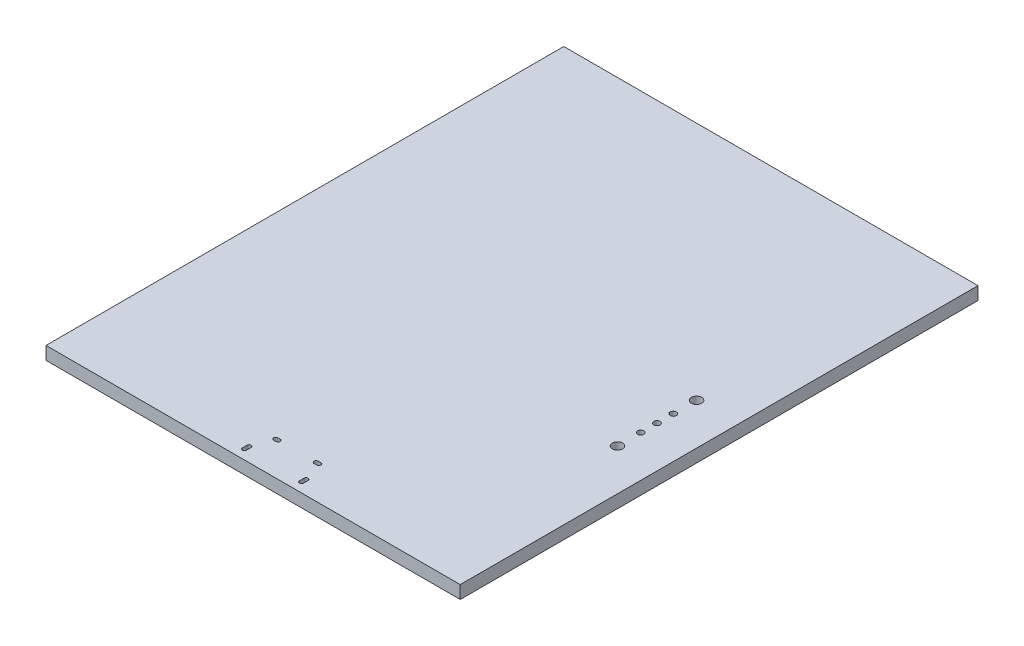
ISO-10303-21;
HEADER;
FILE_DESCRIPTION(('STEP AP214'),'2;1');
FILE_NAME('part.step','',(''),(''),'','','');
FILE_SCHEMA(('AUTOMOTIVE_DESIGN { 1 0 10303 214 1 1 1 1 }'));
ENDSEC;
DATA;
#1=APPLICATION_CONTEXT('core data for automotive mechanical design processes');
#2=APPLICATION_PROTOCOL_DEFINITION('international standard','automotive_design',2000,#1);
#3=PRODUCT_CONTEXT('',#1,'mechanical');
#4=PRODUCT('Part','Part','',(#3));
#5=PRODUCT_RELATED_PRODUCT_CATEGORY('part','',(#4));
#6=PRODUCT_DEFINITION_FORMATION('','',#4);
#7=PRODUCT_DEFINITION_CONTEXT('part definition',#1,'design');
#8=PRODUCT_DEFINITION('design','',#6,#7);
#9=PRODUCT_DEFINITION_SHAPE('','',#8);
#10=(LENGTH_UNIT() NAMED_UNIT(*) SI_UNIT(.MILLI.,.METRE.));
#11=(NAMED_UNIT(*) PLANE_ANGLE_UNIT() SI_UNIT($,.RADIAN.));
#12=(NAMED_UNIT(*) SI_UNIT($,.STERADIAN.) SOLID_ANGLE_UNIT());
#13=UNCERTAINTY_MEASURE_WITH_UNIT(LENGTH_MEASURE(1.E-05),#10,'distance_accuracy_value','');
#14=(GEOMETRIC_REPRESENTATION_CONTEXT(3) GLOBAL_UNCERTAINTY_ASSIGNED_CONTEXT((#13)) GLOBAL_UNIT_ASSIGNED_CONTEXT((#10,
#11,#12)) REPRESENTATION_CONTEXT('',''));
#15=CARTESIAN_POINT('',(0.,0.,0.));
#16=DIRECTION('',(0.,0.,1.));
#17=DIRECTION('',(1.,0.,0.));
#18=AXIS2_PLACEMENT_3D('',#15,#16,#17);
#19=CARTESIAN_POINT('',(-25.4,1.5875,-31.75));
#20=DIRECTION('',(1.,0.,0.));
#21=DIRECTION('',(0.,0.,-1.));
#22=AXIS2_PLACEMENT_3D('',#19,#20,#21);
#23=PLANE('',#22);
#24=DIRECTION('',(0.,0.,1.));
#25=VECTOR('',#24,1.);
#26=CARTESIAN_POINT('',(-25.4,0.,-31.75));
#27=LINE('',#26,#25);
#28=CARTESIAN_POINT('',(-25.4,0.,-31.75));
#29=VERTEX_POINT('',#28);
#30=CARTESIAN_POINT('',(-25.4,0.,31.75));
#31=VERTEX_POINT('',#30);
#32=EDGE_CURVE('E330',#29,#31,#27,.T.);
#33=ORIENTED_EDGE('',*,*,#32,.T.);
#34=DIRECTION('',(0.,-1.,0.));
#35=VECTOR('',#34,1.);
#36=CARTESIAN_POINT('',(-25.4,1.5875,31.75));
#37=LINE('',#36,#35);
#38=CARTESIAN_POINT('',(-25.4,1.5875,31.75));
#39=VERTEX_POINT('',#38);
#40=EDGE_CURVE('E11',#39,#31,#37,.T.);
#41=ORIENTED_EDGE('',*,*,#40,.F.);
#42=DIRECTION('',(0.,0.,1.));
#43=VECTOR('',#42,1.);
#44=CARTESIAN_POINT('',(-25.4,1.5875,-31.75));
#45=LINE('',#44,#43);
#46=CARTESIAN_POINT('',(-25.4,1.5875,-31.75));
#47=VERTEX_POINT('',#46);
#48=EDGE_CURVE('E333',#47,#39,#45,.T.);
#49=ORIENTED_EDGE('',*,*,#48,.F.);
#50=DIRECTION('',(0.,-1.,0.));
#51=VECTOR('',#50,1.);
#52=CARTESIAN_POINT('',(-25.4,1.5875,-31.75));
#53=LINE('',#52,#51);
#54=EDGE_CURVE('E343',#47,#29,#53,.T.);
#55=ORIENTED_EDGE('',*,*,#54,.T.);
#56=EDGE_LOOP('',(#33,#41,#49,#55));
#57=FACE_BOUND('',#56,.T.);
#58=ADVANCED_FACE('F34',(#57),#23,.F.);
#59=CARTESIAN_POINT('',(-25.4,1.5875,31.75));
#60=DIRECTION('',(0.,0.,-1.));
#61=DIRECTION('',(-1.,0.,0.));
#62=AXIS2_PLACEMENT_3D('',#59,#60,#61);
#63=PLANE('',#62);
#64=DIRECTION('',(1.,0.,0.));
#65=VECTOR('',#64,1.);
#66=CARTESIAN_POINT('',(-25.4,0.,31.75));
#67=LINE('',#66,#65);
#68=CARTESIAN_POINT('',(25.4,0.,31.75));
#69=VERTEX_POINT('',#68);
#70=EDGE_CURVE('E346',#31,#69,#67,.T.);
#71=ORIENTED_EDGE('',*,*,#70,.T.);
#72=DIRECTION('',(0.,-1.,0.));
#73=VECTOR('',#72,1.);
#74=CARTESIAN_POINT('',(25.4,1.5875,31.75));
#75=LINE('',#74,#73);
#76=CARTESIAN_POINT('',(25.4,1.5875,31.75));
#77=VERTEX_POINT('',#76);
#78=EDGE_CURVE('E41',#77,#69,#75,.T.);
#79=ORIENTED_EDGE('',*,*,#78,.F.);
#80=DIRECTION('',(1.,0.,0.));
#81=VECTOR('',#80,1.);
#82=CARTESIAN_POINT('',(-25.4,1.5875,31.75));
#83=LINE('',#82,#81);
#84=EDGE_CURVE('E336',#39,#77,#83,.T.);
#85=ORIENTED_EDGE('',*,*,#84,.F.);
#86=ORIENTED_EDGE('',*,*,#40,.T.);
#87=EDGE_LOOP('',(#71,#79,#85,#86));
#88=FACE_BOUND('',#87,.T.);
#89=ADVANCED_FACE('F375',(#88),#63,.F.);
#90=CARTESIAN_POINT('',(25.4,1.5875,-31.75));
#91=DIRECTION('',(-1.,0.,0.));
#92=DIRECTION('',(0.,0.,1.));
#93=AXIS2_PLACEMENT_3D('',#90,#91,#92);
#94=PLANE('',#93);
#95=DIRECTION('',(0.,0.,-1.));
#96=VECTOR('',#95,1.);
#97=CARTESIAN_POINT('',(25.4,0.,-31.75));
#98=LINE('',#97,#96);
#99=CARTESIAN_POINT('',(25.4,0.,-31.75));
#100=VERTEX_POINT('',#99);
#101=EDGE_CURVE('E348',#69,#100,#98,.T.);
#102=ORIENTED_EDGE('',*,*,#101,.T.);
#103=DIRECTION('',(0.,-1.,0.));
#104=VECTOR('',#103,1.);
#105=CARTESIAN_POINT('',(25.4,1.5875,-31.75));
#106=LINE('',#105,#104);
#107=CARTESIAN_POINT('',(25.4,1.5875,-31.75));
#108=VERTEX_POINT('',#107);
#109=EDGE_CURVE('E353',#108,#100,#106,.T.);
#110=ORIENTED_EDGE('',*,*,#109,.F.);
#111=DIRECTION('',(0.,0.,-1.));
#112=VECTOR('',#111,1.);
#113=CARTESIAN_POINT('',(25.4,1.5875,-31.75));
#114=LINE('',#113,#112);
#115=EDGE_CURVE('E339',#77,#108,#114,.T.);
#116=ORIENTED_EDGE('',*,*,#115,.F.);
#117=ORIENTED_EDGE('',*,*,#78,.T.);
#118=EDGE_LOOP('',(#102,#110,#116,#117));
#119=FACE_BOUND('',#118,.T.);
#120=ADVANCED_FACE('F360',(#119),#94,.F.);
#121=CARTESIAN_POINT('',(-25.4,1.5875,-31.75));
#122=DIRECTION('',(0.,0.,1.));
#123=DIRECTION('',(1.,0.,0.));
#124=AXIS2_PLACEMENT_3D('',#121,#122,#123);
#125=PLANE('',#124);
#126=DIRECTION('',(-1.,0.,0.));
#127=VECTOR('',#126,1.);
#128=CARTESIAN_POINT('',(-25.4,0.,-31.75));
#129=LINE('',#128,#127);
#130=EDGE_CURVE('E337',#100,#29,#129,.T.);
#131=ORIENTED_EDGE('',*,*,#130,.T.);
#132=ORIENTED_EDGE('',*,*,#54,.F.);
#133=DIRECTION('',(-1.,0.,0.));
#134=VECTOR('',#133,1.);
#135=CARTESIAN_POINT('',(-25.4,1.5875,-31.75));
#136=LINE('',#135,#134);
#137=EDGE_CURVE('E341',#108,#47,#136,.T.);
#138=ORIENTED_EDGE('',*,*,#137,.F.);
#139=ORIENTED_EDGE('',*,*,#109,.T.);
#140=EDGE_LOOP('',(#131,#132,#138,#139));
#141=FACE_BOUND('',#140,.T.);
#142=ADVANCED_FACE('F368',(#141),#125,.F.);
#143=CARTESIAN_POINT('',(0.,1.5875,0.));
#144=DIRECTION('',(0.,1.,0.));
#145=DIRECTION('',(0.,0.,1.));
#146=AXIS2_PLACEMENT_3D('',#143,#144,#145);
#147=PLANE('',#146);
#148=CARTESIAN_POINT('',(4.76998942836322,1.5875,30.0269949062346));
#149=DIRECTION('',(0.,1.,0.));
#150=DIRECTION('',(0.,0.,1.));
#151=AXIS2_PLACEMENT_3D('',#148,#149,#150);
#152=CIRCLE('',#151,0.250000134999998);
#153=CARTESIAN_POINT('',(5.01998956336322,1.5875,30.0269949062346));
#154=VERTEX_POINT('',#153);
#155=CARTESIAN_POINT('',(4.51998929336322,1.5875,30.0269949062346));
#156=VERTEX_POINT('',#155);
#157=EDGE_CURVE('E48',#154,#156,#152,.T.);
#158=ORIENTED_EDGE('',*,*,#157,.F.);
#159=DIRECTION('',(0.,0.,-1.));
#160=VECTOR('',#159,1.);
#161=CARTESIAN_POINT('',(5.01998956336322,1.5875,30.0269949062346));
#162=LINE('',#161,#160);
#163=CARTESIAN_POINT('',(5.01998956336322,1.5875,30.5769963462346));
#164=VERTEX_POINT('',#163);
#165=EDGE_CURVE('E188',#164,#154,#162,.T.);
#166=ORIENTED_EDGE('',*,*,#165,.F.);
#167=CARTESIAN_POINT('',(4.76998942836322,1.5875,30.5769963462346));
#168=DIRECTION('',(0.,1.,0.));
#169=DIRECTION('',(0.,0.,1.));
#170=AXIS2_PLACEMENT_3D('',#167,#168,#169);
#171=CIRCLE('',#170,0.250000134999998);
#172=CARTESIAN_POINT('',(4.51998929336322,1.5875,30.5769963462346));
#173=VERTEX_POINT('',#172);
#174=EDGE_CURVE('E191',#173,#164,#171,.T.);
#175=ORIENTED_EDGE('',*,*,#174,.F.);
#176=DIRECTION('',(0.,0.,1.));
#177=VECTOR('',#176,1.);
#178=CARTESIAN_POINT('',(4.51998929336322,1.5875,30.0269949062346));
#179=LINE('',#178,#177);
#180=EDGE_CURVE('E197',#156,#173,#179,.T.);
#181=ORIENTED_EDGE('',*,*,#180,.F.);
#182=EDGE_LOOP('',(#158,#166,#175,#181));
#183=FACE_BOUND('',#182,.T.);
#184=CARTESIAN_POINT('',(3.56998928836323,1.5875,27.6019959462346));
#185=DIRECTION('',(0.,1.,0.));
#186=DIRECTION('',(0.,0.,1.));
#187=AXIS2_PLACEMENT_3D('',#184,#185,#186);
#188=CIRCLE('',#187,0.250000134999984);
#189=CARTESIAN_POINT('',(3.56998928836323,1.5875,27.3519958112346));
#190=VERTEX_POINT('',#189);
#191=CARTESIAN_POINT('',(3.56998928836323,1.5875,27.8519960812346));
#192=VERTEX_POINT('',#191);
#193=EDGE_CURVE('E203',#190,#192,#188,.T.);
#194=ORIENTED_EDGE('',*,*,#193,.F.);
#195=DIRECTION('',(-1.,0.,0.));
#196=VECTOR('',#195,1.);
#197=CARTESIAN_POINT('',(3.56998928836323,1.5875,27.3519958112346));
#198=LINE('',#197,#196);
#199=CARTESIAN_POINT('',(3.91998858836322,1.5875,27.3519958112346));
#200=VERTEX_POINT('',#199);
#201=EDGE_CURVE('E211',#200,#190,#198,.T.);
#202=ORIENTED_EDGE('',*,*,#201,.F.);
#203=CARTESIAN_POINT('',(3.91998858836322,1.5875,27.6019959462346));
#204=DIRECTION('',(0.,1.,0.));
#205=DIRECTION('',(0.,0.,1.));
#206=AXIS2_PLACEMENT_3D('',#203,#204,#205);
#207=CIRCLE('',#206,0.25000013499998);
#208=CARTESIAN_POINT('',(3.91998858836322,1.5875,27.8519960812346));
#209=VERTEX_POINT('',#208);
#210=EDGE_CURVE('E225',#209,#200,#207,.T.);
#211=ORIENTED_EDGE('',*,*,#210,.F.);
#212=DIRECTION('',(1.,0.,0.));
#213=VECTOR('',#212,1.);
#214=CARTESIAN_POINT('',(3.56998928836323,1.5875,27.8519960812346));
#215=LINE('',#214,#213);
#216=EDGE_CURVE('E222',#192,#209,#215,.T.);
#217=ORIENTED_EDGE('',*,*,#216,.F.);
#218=EDGE_LOOP('',(#194,#202,#211,#217));
#219=FACE_BOUND('',#218,.T.);
#220=CARTESIAN_POINT('',(-1.38001097163677,1.5875,27.6019959462346));
#221=DIRECTION('',(0.,1.,0.));
#222=DIRECTION('',(0.,0.,1.));
#223=AXIS2_PLACEMENT_3D('',#220,#221,#222);
#224=CIRCLE('',#223,0.250000134999998);
#225=CARTESIAN_POINT('',(-1.38001097163677,1.5875,27.3519958112346));
#226=VERTEX_POINT('',#225);
#227=CARTESIAN_POINT('',(-1.38001097163677,1.5875,27.8519960812346));
#228=VERTEX_POINT('',#227);
#229=EDGE_CURVE('E232',#226,#228,#224,.T.);
#230=ORIENTED_EDGE('',*,*,#229,.F.);
#231=DIRECTION('',(-1.,0.,0.));
#232=VECTOR('',#231,1.);
#233=CARTESIAN_POINT('',(-1.38001097163677,1.5875,27.3519958112346));
#234=LINE('',#233,#232);
#235=CARTESIAN_POINT('',(-1.0800115716368,1.5875,27.3519958112346));
#236=VERTEX_POINT('',#235);
#237=EDGE_CURVE('E243',#236,#226,#234,.T.);
#238=ORIENTED_EDGE('',*,*,#237,.F.);
#239=CARTESIAN_POINT('',(-1.0800115716368,1.5875,27.6019959462346));
#240=DIRECTION('',(0.,1.,0.));
#241=DIRECTION('',(0.,0.,1.));
#242=AXIS2_PLACEMENT_3D('',#239,#240,#241);
#243=CIRCLE('',#242,0.250000134999998);
#244=CARTESIAN_POINT('',(-1.0800115716368,1.5875,27.8519960812346));
#245=VERTEX_POINT('',#244);
#246=EDGE_CURVE('E257',#245,#236,#243,.T.);
#247=ORIENTED_EDGE('',*,*,#246,.F.);
#248=DIRECTION('',(1.,0.,0.));
#249=VECTOR('',#248,1.);
#250=CARTESIAN_POINT('',(-1.38001097163677,1.5875,27.8519960812346));
#251=LINE('',#250,#249);
#252=EDGE_CURVE('E254',#228,#245,#251,.T.);
#253=ORIENTED_EDGE('',*,*,#252,.F.);
#254=EDGE_LOOP('',(#230,#238,#247,#253));
#255=FACE_BOUND('',#254,.T.);
#256=CARTESIAN_POINT('',(-2.23001181163678,1.5875,30.0269949062346));
#257=DIRECTION('',(0.,1.,0.));
#258=DIRECTION('',(0.,0.,1.));
#259=AXIS2_PLACEMENT_3D('',#256,#257,#258);
#260=CIRCLE('',#259,0.250000134999983);
#261=CARTESIAN_POINT('',(-1.98001167663679,1.5875,30.0269949062346));
#262=VERTEX_POINT('',#261);
#263=CARTESIAN_POINT('',(-2.48001194663676,1.5875,30.0269949062346));
#264=VERTEX_POINT('',#263);
#265=EDGE_CURVE('E264',#262,#264,#260,.T.);
#266=ORIENTED_EDGE('',*,*,#265,.F.);
#267=DIRECTION('',(0.,0.,-1.));
#268=VECTOR('',#267,1.);
#269=CARTESIAN_POINT('',(-1.98001167663679,1.5875,30.0269949062346));
#270=LINE('',#269,#268);
#271=CARTESIAN_POINT('',(-1.98001167663679,1.5875,30.5769963462346));
#272=VERTEX_POINT('',#271);
#273=EDGE_CURVE('E275',#272,#262,#270,.T.);
#274=ORIENTED_EDGE('',*,*,#273,.F.);
#275=CARTESIAN_POINT('',(-2.23001181163678,1.5875,30.5769963462346));
#276=DIRECTION('',(0.,1.,0.));
#277=DIRECTION('',(0.,0.,1.));
#278=AXIS2_PLACEMENT_3D('',#275,#276,#277);
#279=CIRCLE('',#278,0.250000134999983);
#280=CARTESIAN_POINT('',(-2.48001194663676,1.5875,30.5769963462346));
#281=VERTEX_POINT('',#280);
#282=EDGE_CURVE('E289',#281,#272,#279,.T.);
#283=ORIENTED_EDGE('',*,*,#282,.F.);
#284=DIRECTION('',(0.,0.,1.));
#285=VECTOR('',#284,1.);
#286=CARTESIAN_POINT('',(-2.48001194663676,1.5875,30.0269949062346));
#287=LINE('',#286,#285);
#288=EDGE_CURVE('E286',#264,#281,#287,.T.);
#289=ORIENTED_EDGE('',*,*,#288,.F.);
#290=EDGE_LOOP('',(#266,#274,#283,#289));
#291=FACE_BOUND('',#290,.T.);
#292=CARTESIAN_POINT('',(20.3199888083632,1.5875,-2.31020483376541));
#293=DIRECTION('',(0.,1.,0.));
#294=DIRECTION('',(0.,0.,1.));
#295=AXIS2_PLACEMENT_3D('',#292,#293,#294);
#296=CIRCLE('',#295,0.631750069999991);
#297=CARTESIAN_POINT('',(20.3199888083632,1.5875,-1.67845476376542));
#298=VERTEX_POINT('',#297);
#299=EDGE_CURVE('E296',#298,#298,#296,.T.);
#300=ORIENTED_EDGE('',*,*,#299,.F.);
#301=EDGE_LOOP('',(#300));
#302=FACE_BOUND('',#301,.T.);
#303=CARTESIAN_POINT('',(20.3199888083632,1.5875,0.539794546234582));
#304=DIRECTION('',(0.,1.,0.));
#305=DIRECTION('',(0.,0.,1.));
#306=AXIS2_PLACEMENT_3D('',#303,#304,#305);
#307=CIRCLE('',#306,0.38174993499998);
#308=CARTESIAN_POINT('',(20.3199888083632,1.5875,0.921544481234561));
#309=VERTEX_POINT('',#308);
#310=EDGE_CURVE('E306',#309,#309,#307,.T.);
#311=ORIENTED_EDGE('',*,*,#310,.F.);
#312=EDGE_LOOP('',(#311));
#313=FACE_BOUND('',#312,.T.);
#314=CARTESIAN_POINT('',(20.3199888083632,1.5875,2.53979562623462));
#315=DIRECTION('',(0.,1.,0.));
#316=DIRECTION('',(0.,0.,1.));
#317=AXIS2_PLACEMENT_3D('',#314,#315,#316);
#318=CIRCLE('',#317,0.381749935000009);
#319=CARTESIAN_POINT('',(20.3199888083632,1.5875,2.92154556123463));
#320=VERTEX_POINT('',#319);
#321=EDGE_CURVE('E312',#320,#320,#318,.T.);
#322=ORIENTED_EDGE('',*,*,#321,.F.);
#323=EDGE_LOOP('',(#322));
#324=FACE_BOUND('',#323,.T.);
#325=CARTESIAN_POINT('',(20.3199888083632,1.5875,4.5397967062346));
#326=DIRECTION('',(0.,1.,0.));
#327=DIRECTION('',(0.,0.,1.));
#328=AXIS2_PLACEMENT_3D('',#325,#326,#327);
#329=CIRCLE('',#328,0.381749935000009);
#330=CARTESIAN_POINT('',(20.3199888083632,1.5875,4.92154664123461));
#331=VERTEX_POINT('',#330);
#332=EDGE_CURVE('E318',#331,#331,#329,.T.);
#333=ORIENTED_EDGE('',*,*,#332,.F.);
#334=EDGE_LOOP('',(#333));
#335=FACE_BOUND('',#334,.T.);
#336=CARTESIAN_POINT('',(20.3199888083632,1.5875,7.38979608623459));
#337=DIRECTION('',(0.,1.,0.));
#338=DIRECTION('',(0.,0.,1.));
#339=AXIS2_PLACEMENT_3D('',#336,#337,#338);
#340=CIRCLE('',#339,0.631750069999991);
#341=CARTESIAN_POINT('',(20.3199888083632,1.5875,8.02154615623458));
#342=VERTEX_POINT('',#341);
#343=EDGE_CURVE('E324',#342,#342,#340,.T.);
#344=ORIENTED_EDGE('',*,*,#343,.F.);
#345=EDGE_LOOP('',(#344));
#346=FACE_BOUND('',#345,.T.);
#347=ORIENTED_EDGE('',*,*,#48,.T.);
#348=ORIENTED_EDGE('',*,*,#84,.T.);
#349=ORIENTED_EDGE('',*,*,#115,.T.);
#350=ORIENTED_EDGE('',*,*,#137,.T.);
#351=EDGE_LOOP('',(#347,#348,#349,#350));
#352=FACE_BOUND('',#351,.T.);
#353=ADVANCED_FACE('F374',(#183,#219,#255,#291,#302,#313,#324,#335,#346,#352),#147,.T.);
#354=CARTESIAN_POINT('',(0.,0.,0.));
#355=DIRECTION('',(0.,1.,0.));
#356=DIRECTION('',(0.,0.,1.));
#357=AXIS2_PLACEMENT_3D('',#354,#355,#356);
#358=PLANE('',#357);
#359=DIRECTION('',(0.,0.,-1.));
#360=VECTOR('',#359,1.);
#361=CARTESIAN_POINT('',(5.01998956336322,0.,30.0269949062346));
#362=LINE('',#361,#360);
#363=CARTESIAN_POINT('',(5.01998956336322,0.,30.5769963462346));
#364=VERTEX_POINT('',#363);
#365=CARTESIAN_POINT('',(5.01998956336322,0.,30.0269949062346));
#366=VERTEX_POINT('',#365);
#367=EDGE_CURVE('E178',#364,#366,#362,.T.);
#368=ORIENTED_EDGE('',*,*,#367,.T.);
#369=CARTESIAN_POINT('',(4.76998942836322,0.,30.0269949062346));
#370=DIRECTION('',(0.,1.,0.));
#371=DIRECTION('',(0.,0.,1.));
#372=AXIS2_PLACEMENT_3D('',#369,#370,#371);
#373=CIRCLE('',#372,0.250000134999998);
#374=CARTESIAN_POINT('',(4.51998929336322,0.,30.0269949062346));
#375=VERTEX_POINT('',#374);
#376=EDGE_CURVE('E172',#366,#375,#373,.T.);
#377=ORIENTED_EDGE('',*,*,#376,.T.);
#378=DIRECTION('',(0.,0.,1.));
#379=VECTOR('',#378,1.);
#380=CARTESIAN_POINT('',(4.51998929336322,0.,30.0269949062346));
#381=LINE('',#380,#379);
#382=CARTESIAN_POINT('',(4.51998929336322,0.,30.5769963462346));
#383=VERTEX_POINT('',#382);
#384=EDGE_CURVE('E181',#375,#383,#381,.T.);
#385=ORIENTED_EDGE('',*,*,#384,.T.);
#386=CARTESIAN_POINT('',(4.76998942836322,0.,30.5769963462346));
#387=DIRECTION('',(0.,1.,0.));
#388=DIRECTION('',(0.,0.,1.));
#389=AXIS2_PLACEMENT_3D('',#386,#387,#388);
#390=CIRCLE('',#389,0.250000134999998);
#391=EDGE_CURVE('E56',#383,#364,#390,.T.);
#392=ORIENTED_EDGE('',*,*,#391,.T.);
#393=EDGE_LOOP('',(#368,#377,#385,#392));
#394=FACE_BOUND('',#393,.T.);
#395=DIRECTION('',(-1.,0.,0.));
#396=VECTOR('',#395,1.);
#397=CARTESIAN_POINT('',(3.56998928836323,0.,27.3519958112346));
#398=LINE('',#397,#396);
#399=CARTESIAN_POINT('',(3.91998858836322,0.,27.3519958112346));
#400=VERTEX_POINT('',#399);
#401=CARTESIAN_POINT('',(3.56998928836323,0.,27.3519958112346));
#402=VERTEX_POINT('',#401);
#403=EDGE_CURVE('E217',#400,#402,#398,.T.);
#404=ORIENTED_EDGE('',*,*,#403,.T.);
#405=CARTESIAN_POINT('',(3.56998928836323,0.,27.6019959462346));
#406=DIRECTION('',(0.,1.,0.));
#407=DIRECTION('',(0.,0.,1.));
#408=AXIS2_PLACEMENT_3D('',#405,#406,#407);
#409=CIRCLE('',#408,0.250000134999984);
#410=CARTESIAN_POINT('',(3.56998928836323,0.,27.8519960812346));
#411=VERTEX_POINT('',#410);
#412=EDGE_CURVE('E207',#402,#411,#409,.T.);
#413=ORIENTED_EDGE('',*,*,#412,.T.);
#414=DIRECTION('',(1.,0.,0.));
#415=VECTOR('',#414,1.);
#416=CARTESIAN_POINT('',(3.56998928836323,0.,27.8519960812346));
#417=LINE('',#416,#415);
#418=CARTESIAN_POINT('',(3.91998858836322,0.,27.8519960812346));
#419=VERTEX_POINT('',#418);
#420=EDGE_CURVE('E210',#411,#419,#417,.T.);
#421=ORIENTED_EDGE('',*,*,#420,.T.);
#422=CARTESIAN_POINT('',(3.91998858836322,0.,27.6019959462346));
#423=DIRECTION('',(0.,1.,0.));
#424=DIRECTION('',(0.,0.,1.));
#425=AXIS2_PLACEMENT_3D('',#422,#423,#424);
#426=CIRCLE('',#425,0.25000013499998);
#427=EDGE_CURVE('E214',#419,#400,#426,.T.);
#428=ORIENTED_EDGE('',*,*,#427,.T.);
#429=EDGE_LOOP('',(#404,#413,#421,#428));
#430=FACE_BOUND('',#429,.T.);
#431=DIRECTION('',(-1.,0.,0.));
#432=VECTOR('',#431,1.);
#433=CARTESIAN_POINT('',(-1.38001097163677,0.,27.3519958112346));
#434=LINE('',#433,#432);
#435=CARTESIAN_POINT('',(-1.0800115716368,0.,27.3519958112346));
#436=VERTEX_POINT('',#435);
#437=CARTESIAN_POINT('',(-1.38001097163677,0.,27.3519958112346));
#438=VERTEX_POINT('',#437);
#439=EDGE_CURVE('E249',#436,#438,#434,.T.);
#440=ORIENTED_EDGE('',*,*,#439,.T.);
#441=CARTESIAN_POINT('',(-1.38001097163677,0.,27.6019959462346));
#442=DIRECTION('',(0.,1.,0.));
#443=DIRECTION('',(0.,0.,1.));
#444=AXIS2_PLACEMENT_3D('',#441,#442,#443);
#445=CIRCLE('',#444,0.250000134999998);
#446=CARTESIAN_POINT('',(-1.38001097163677,0.,27.8519960812346));
#447=VERTEX_POINT('',#446);
#448=EDGE_CURVE('E239',#438,#447,#445,.T.);
#449=ORIENTED_EDGE('',*,*,#448,.T.);
#450=DIRECTION('',(1.,0.,0.));
#451=VECTOR('',#450,1.);
#452=CARTESIAN_POINT('',(-1.38001097163677,0.,27.8519960812346));
#453=LINE('',#452,#451);
#454=CARTESIAN_POINT('',(-1.0800115716368,0.,27.8519960812346));
#455=VERTEX_POINT('',#454);
#456=EDGE_CURVE('E242',#447,#455,#453,.T.);
#457=ORIENTED_EDGE('',*,*,#456,.T.);
#458=CARTESIAN_POINT('',(-1.0800115716368,0.,27.6019959462346));
#459=DIRECTION('',(0.,1.,0.));
#460=DIRECTION('',(0.,0.,1.));
#461=AXIS2_PLACEMENT_3D('',#458,#459,#460);
#462=CIRCLE('',#461,0.250000134999998);
#463=EDGE_CURVE('E246',#455,#436,#462,.T.);
#464=ORIENTED_EDGE('',*,*,#463,.T.);
#465=EDGE_LOOP('',(#440,#449,#457,#464));
#466=FACE_BOUND('',#465,.T.);
#467=DIRECTION('',(0.,0.,-1.));
#468=VECTOR('',#467,1.);
#469=CARTESIAN_POINT('',(-1.98001167663679,0.,30.0269949062346));
#470=LINE('',#469,#468);
#471=CARTESIAN_POINT('',(-1.98001167663679,0.,30.5769963462346));
#472=VERTEX_POINT('',#471);
#473=CARTESIAN_POINT('',(-1.98001167663679,0.,30.0269949062346));
#474=VERTEX_POINT('',#473);
#475=EDGE_CURVE('E281',#472,#474,#470,.T.);
#476=ORIENTED_EDGE('',*,*,#475,.T.);
#477=CARTESIAN_POINT('',(-2.23001181163678,0.,30.0269949062346));
#478=DIRECTION('',(0.,1.,0.));
#479=DIRECTION('',(0.,0.,1.));
#480=AXIS2_PLACEMENT_3D('',#477,#478,#479);
#481=CIRCLE('',#480,0.250000134999983);
#482=CARTESIAN_POINT('',(-2.48001194663676,0.,30.0269949062346));
#483=VERTEX_POINT('',#482);
#484=EDGE_CURVE('E271',#474,#483,#481,.T.);
#485=ORIENTED_EDGE('',*,*,#484,.T.);
#486=DIRECTION('',(0.,0.,1.));
#487=VECTOR('',#486,1.);
#488=CARTESIAN_POINT('',(-2.48001194663676,0.,30.0269949062346));
#489=LINE('',#488,#487);
#490=CARTESIAN_POINT('',(-2.48001194663676,0.,30.5769963462346));
#491=VERTEX_POINT('',#490);
#492=EDGE_CURVE('E274',#483,#491,#489,.T.);
#493=ORIENTED_EDGE('',*,*,#492,.T.);
#494=CARTESIAN_POINT('',(-2.23001181163678,0.,30.5769963462346));
#495=DIRECTION('',(0.,1.,0.));
#496=DIRECTION('',(0.,0.,1.));
#497=AXIS2_PLACEMENT_3D('',#494,#495,#496);
#498=CIRCLE('',#497,0.250000134999983);
#499=EDGE_CURVE('E278',#491,#472,#498,.T.);
#500=ORIENTED_EDGE('',*,*,#499,.T.);
#501=EDGE_LOOP('',(#476,#485,#493,#500));
#502=FACE_BOUND('',#501,.T.);
#503=CARTESIAN_POINT('',(20.3199888083632,0.,-2.31020483376541));
#504=DIRECTION('',(0.,1.,0.));
#505=DIRECTION('',(0.,0.,1.));
#506=AXIS2_PLACEMENT_3D('',#503,#504,#505);
#507=CIRCLE('',#506,0.631750069999991);
#508=CARTESIAN_POINT('',(20.3199888083632,0.,-1.67845476376542));
#509=VERTEX_POINT('',#508);
#510=EDGE_CURVE('E303',#509,#509,#507,.T.);
#511=ORIENTED_EDGE('',*,*,#510,.T.);
#512=EDGE_LOOP('',(#511));
#513=FACE_BOUND('',#512,.T.);
#514=CARTESIAN_POINT('',(20.3199888083632,0.,0.539794546234582));
#515=DIRECTION('',(0.,1.,0.));
#516=DIRECTION('',(0.,0.,1.));
#517=AXIS2_PLACEMENT_3D('',#514,#515,#516);
#518=CIRCLE('',#517,0.38174993499998);
#519=CARTESIAN_POINT('',(20.3199888083632,0.,0.921544481234561));
#520=VERTEX_POINT('',#519);
#521=EDGE_CURVE('E309',#520,#520,#518,.T.);
#522=ORIENTED_EDGE('',*,*,#521,.T.);
#523=EDGE_LOOP('',(#522));
#524=FACE_BOUND('',#523,.T.);
#525=CARTESIAN_POINT('',(20.3199888083632,0.,2.53979562623462));
#526=DIRECTION('',(0.,1.,0.));
#527=DIRECTION('',(0.,0.,1.));
#528=AXIS2_PLACEMENT_3D('',#525,#526,#527);
#529=CIRCLE('',#528,0.381749935000009);
#530=CARTESIAN_POINT('',(20.3199888083632,0.,2.92154556123463));
#531=VERTEX_POINT('',#530);
#532=EDGE_CURVE('E315',#531,#531,#529,.T.);
#533=ORIENTED_EDGE('',*,*,#532,.T.);
#534=EDGE_LOOP('',(#533));
#535=FACE_BOUND('',#534,.T.);
#536=CARTESIAN_POINT('',(20.3199888083632,0.,4.5397967062346));
#537=DIRECTION('',(0.,1.,0.));
#538=DIRECTION('',(0.,0.,1.));
#539=AXIS2_PLACEMENT_3D('',#536,#537,#538);
#540=CIRCLE('',#539,0.381749935000009);
#541=CARTESIAN_POINT('',(20.3199888083632,0.,4.92154664123461));
#542=VERTEX_POINT('',#541);
#543=EDGE_CURVE('E321',#542,#542,#540,.T.);
#544=ORIENTED_EDGE('',*,*,#543,.T.);
#545=EDGE_LOOP('',(#544));
#546=FACE_BOUND('',#545,.T.);
#547=CARTESIAN_POINT('',(20.3199888083632,0.,7.38979608623459));
#548=DIRECTION('',(0.,1.,0.));
#549=DIRECTION('',(0.,0.,1.));
#550=AXIS2_PLACEMENT_3D('',#547,#548,#549);
#551=CIRCLE('',#550,0.631750069999991);
#552=CARTESIAN_POINT('',(20.3199888083632,0.,8.02154615623458));
#553=VERTEX_POINT('',#552);
#554=EDGE_CURVE('E327',#553,#553,#551,.T.);
#555=ORIENTED_EDGE('',*,*,#554,.T.);
#556=EDGE_LOOP('',(#555));
#557=FACE_BOUND('',#556,.T.);
#558=ORIENTED_EDGE('',*,*,#32,.F.);
#559=ORIENTED_EDGE('',*,*,#130,.F.);
#560=ORIENTED_EDGE('',*,*,#101,.F.);
#561=ORIENTED_EDGE('',*,*,#70,.F.);
#562=EDGE_LOOP('',(#558,#559,#560,#561));
#563=FACE_BOUND('',#562,.T.);
#564=ADVANCED_FACE('F185',(#394,#430,#466,#502,#513,#524,#535,#546,#557,#563),#358,.F.);
#565=CARTESIAN_POINT('',(20.3199888083632,0.,7.38979608623459));
#566=DIRECTION('',(0.,1.,0.));
#567=DIRECTION('',(0.,0.,1.));
#568=AXIS2_PLACEMENT_3D('',#565,#566,#567);
#569=CYLINDRICAL_SURFACE('',#568,0.631750069999991);
#570=ORIENTED_EDGE('',*,*,#554,.F.);
#571=EDGE_LOOP('',(#570));
#572=FACE_BOUND('',#571,.T.);
#573=ORIENTED_EDGE('',*,*,#343,.T.);
#574=EDGE_LOOP('',(#573));
#575=FACE_BOUND('',#574,.T.);
#576=ADVANCED_FACE('F387',(#572,#575),#569,.F.);
#577=CARTESIAN_POINT('',(20.3199888083632,0.,4.5397967062346));
#578=DIRECTION('',(0.,1.,0.));
#579=DIRECTION('',(0.,0.,1.));
#580=AXIS2_PLACEMENT_3D('',#577,#578,#579);
#581=CYLINDRICAL_SURFACE('',#580,0.381749935000009);
#582=ORIENTED_EDGE('',*,*,#543,.F.);
#583=EDGE_LOOP('',(#582));
#584=FACE_BOUND('',#583,.T.);
#585=ORIENTED_EDGE('',*,*,#332,.T.);
#586=EDGE_LOOP('',(#585));
#587=FACE_BOUND('',#586,.T.);
#588=ADVANCED_FACE('F393',(#584,#587),#581,.F.);
#589=CARTESIAN_POINT('',(20.3199888083632,0.,2.53979562623462));
#590=DIRECTION('',(0.,1.,0.));
#591=DIRECTION('',(0.,0.,1.));
#592=AXIS2_PLACEMENT_3D('',#589,#590,#591);
#593=CYLINDRICAL_SURFACE('',#592,0.381749935000009);
#594=ORIENTED_EDGE('',*,*,#532,.F.);
#595=EDGE_LOOP('',(#594));
#596=FACE_BOUND('',#595,.T.);
#597=ORIENTED_EDGE('',*,*,#321,.T.);
#598=EDGE_LOOP('',(#597));
#599=FACE_BOUND('',#598,.T.);
#600=ADVANCED_FACE('F397',(#596,#599),#593,.F.);
#601=CARTESIAN_POINT('',(20.3199888083632,0.,0.539794546234582));
#602=DIRECTION('',(0.,1.,0.));
#603=DIRECTION('',(0.,0.,1.));
#604=AXIS2_PLACEMENT_3D('',#601,#602,#603);
#605=CYLINDRICAL_SURFACE('',#604,0.38174993499998);
#606=ORIENTED_EDGE('',*,*,#521,.F.);
#607=EDGE_LOOP('',(#606));
#608=FACE_BOUND('',#607,.T.);
#609=ORIENTED_EDGE('',*,*,#310,.T.);
#610=EDGE_LOOP('',(#609));
#611=FACE_BOUND('',#610,.T.);
#612=ADVANCED_FACE('F401',(#608,#611),#605,.F.);
#613=CARTESIAN_POINT('',(20.3199888083632,0.,-2.31020483376541));
#614=DIRECTION('',(0.,1.,0.));
#615=DIRECTION('',(0.,0.,1.));
#616=AXIS2_PLACEMENT_3D('',#613,#614,#615);
#617=CYLINDRICAL_SURFACE('',#616,0.631750069999991);
#618=ORIENTED_EDGE('',*,*,#510,.F.);
#619=EDGE_LOOP('',(#618));
#620=FACE_BOUND('',#619,.T.);
#621=ORIENTED_EDGE('',*,*,#299,.T.);
#622=EDGE_LOOP('',(#621));
#623=FACE_BOUND('',#622,.T.);
#624=ADVANCED_FACE('F405',(#620,#623),#617,.F.);
#625=CARTESIAN_POINT('',(-2.23001181163678,0.,30.0269949062346));
#626=DIRECTION('',(0.,1.,0.));
#627=DIRECTION('',(0.,0.,1.));
#628=AXIS2_PLACEMENT_3D('',#625,#626,#627);
#629=CYLINDRICAL_SURFACE('',#628,0.250000134999983);
#630=ORIENTED_EDGE('',*,*,#265,.T.);
#631=DIRECTION('',(0.,1.,0.));
#632=VECTOR('',#631,1.);
#633=CARTESIAN_POINT('',(-2.48001194663676,0.,30.0269949062346));
#634=LINE('',#633,#632);
#635=EDGE_CURVE('E284',#483,#264,#634,.T.);
#636=ORIENTED_EDGE('',*,*,#635,.F.);
#637=ORIENTED_EDGE('',*,*,#484,.F.);
#638=DIRECTION('',(0.,1.,0.));
#639=VECTOR('',#638,1.);
#640=CARTESIAN_POINT('',(-1.98001167663679,0.,30.0269949062346));
#641=LINE('',#640,#639);
#642=EDGE_CURVE('E294',#474,#262,#641,.T.);
#643=ORIENTED_EDGE('',*,*,#642,.T.);
#644=EDGE_LOOP('',(#630,#636,#637,#643));
#645=FACE_BOUND('',#644,.T.);
#646=ADVANCED_FACE('F409',(#645),#629,.F.);
#647=CARTESIAN_POINT('',(-1.98001167663679,0.,30.0269949062346));
#648=DIRECTION('',(1.,0.,0.));
#649=DIRECTION('',(0.,0.,-1.));
#650=AXIS2_PLACEMENT_3D('',#647,#648,#649);
#651=PLANE('',#650);
#652=ORIENTED_EDGE('',*,*,#273,.T.);
#653=ORIENTED_EDGE('',*,*,#642,.F.);
#654=ORIENTED_EDGE('',*,*,#475,.F.);
#655=DIRECTION('',(0.,1.,0.));
#656=VECTOR('',#655,1.);
#657=CARTESIAN_POINT('',(-1.98001167663679,0.,30.5769963462346));
#658=LINE('',#657,#656);
#659=EDGE_CURVE('E297',#472,#272,#658,.T.);
#660=ORIENTED_EDGE('',*,*,#659,.T.);
#661=EDGE_LOOP('',(#652,#653,#654,#660));
#662=FACE_BOUND('',#661,.T.);
#663=ADVANCED_FACE('F413',(#662),#651,.F.);
#664=CARTESIAN_POINT('',(-2.23001181163678,0.,30.5769963462346));
#665=DIRECTION('',(0.,1.,0.));
#666=DIRECTION('',(0.,0.,1.));
#667=AXIS2_PLACEMENT_3D('',#664,#665,#666);
#668=CYLINDRICAL_SURFACE('',#667,0.250000134999983);
#669=ORIENTED_EDGE('',*,*,#282,.T.);
#670=ORIENTED_EDGE('',*,*,#659,.F.);
#671=ORIENTED_EDGE('',*,*,#499,.F.);
#672=DIRECTION('',(0.,1.,0.));
#673=VECTOR('',#672,1.);
#674=CARTESIAN_POINT('',(-2.48001194663676,0.,30.5769963462346));
#675=LINE('',#674,#673);
#676=EDGE_CURVE('E299',#491,#281,#675,.T.);
#677=ORIENTED_EDGE('',*,*,#676,.T.);
#678=EDGE_LOOP('',(#669,#670,#671,#677));
#679=FACE_BOUND('',#678,.T.);
#680=ADVANCED_FACE('F419',(#679),#668,.F.);
#681=CARTESIAN_POINT('',(-2.48001194663676,0.,30.0269949062346));
#682=DIRECTION('',(-1.,0.,0.));
#683=DIRECTION('',(0.,0.,1.));
#684=AXIS2_PLACEMENT_3D('',#681,#682,#683);
#685=PLANE('',#684);
#686=ORIENTED_EDGE('',*,*,#288,.T.);
#687=ORIENTED_EDGE('',*,*,#676,.F.);
#688=ORIENTED_EDGE('',*,*,#492,.F.);
#689=ORIENTED_EDGE('',*,*,#635,.T.);
#690=EDGE_LOOP('',(#686,#687,#688,#689));
#691=FACE_BOUND('',#690,.T.);
#692=ADVANCED_FACE('F415',(#691),#685,.F.);
#693=CARTESIAN_POINT('',(-1.38001097163677,0.,27.6019959462346));
#694=DIRECTION('',(0.,1.,0.));
#695=DIRECTION('',(0.,0.,1.));
#696=AXIS2_PLACEMENT_3D('',#693,#694,#695);
#697=CYLINDRICAL_SURFACE('',#696,0.250000134999998);
#698=ORIENTED_EDGE('',*,*,#229,.T.);
#699=DIRECTION('',(0.,1.,0.));
#700=VECTOR('',#699,1.);
#701=CARTESIAN_POINT('',(-1.38001097163677,0.,27.8519960812346));
#702=LINE('',#701,#700);
#703=EDGE_CURVE('E252',#447,#228,#702,.T.);
#704=ORIENTED_EDGE('',*,*,#703,.F.);
#705=ORIENTED_EDGE('',*,*,#448,.F.);
#706=DIRECTION('',(0.,1.,0.));
#707=VECTOR('',#706,1.);
#708=CARTESIAN_POINT('',(-1.38001097163677,0.,27.3519958112346));
#709=LINE('',#708,#707);
#710=EDGE_CURVE('E262',#438,#226,#709,.T.);
#711=ORIENTED_EDGE('',*,*,#710,.T.);
#712=EDGE_LOOP('',(#698,#704,#705,#711));
#713=FACE_BOUND('',#712,.T.);
#714=ADVANCED_FACE('F418',(#713),#697,.F.);
#715=CARTESIAN_POINT('',(-1.38001097163677,0.,27.3519958112346));
#716=DIRECTION('',(0.,0.,-1.));
#717=DIRECTION('',(-1.,0.,0.));
#718=AXIS2_PLACEMENT_3D('',#715,#716,#717);
#719=PLANE('',#718);
#720=ORIENTED_EDGE('',*,*,#237,.T.);
#721=ORIENTED_EDGE('',*,*,#710,.F.);
#722=ORIENTED_EDGE('',*,*,#439,.F.);
#723=DIRECTION('',(0.,1.,0.));
#724=VECTOR('',#723,1.);
#725=CARTESIAN_POINT('',(-1.0800115716368,0.,27.3519958112346));
#726=LINE('',#725,#724);
#727=EDGE_CURVE('E265',#436,#236,#726,.T.);
#728=ORIENTED_EDGE('',*,*,#727,.T.);
#729=EDGE_LOOP('',(#720,#721,#722,#728));
#730=FACE_BOUND('',#729,.T.);
#731=ADVANCED_FACE('F429',(#730),#719,.F.);
#732=CARTESIAN_POINT('',(-1.0800115716368,0.,27.6019959462346));
#733=DIRECTION('',(0.,1.,0.));
#734=DIRECTION('',(0.,0.,1.));
#735=AXIS2_PLACEMENT_3D('',#732,#733,#734);
#736=CYLINDRICAL_SURFACE('',#735,0.250000134999998);
#737=ORIENTED_EDGE('',*,*,#246,.T.);
#738=ORIENTED_EDGE('',*,*,#727,.F.);
#739=ORIENTED_EDGE('',*,*,#463,.F.);
#740=DIRECTION('',(0.,1.,0.));
#741=VECTOR('',#740,1.);
#742=CARTESIAN_POINT('',(-1.0800115716368,0.,27.8519960812346));
#743=LINE('',#742,#741);
#744=EDGE_CURVE('E267',#455,#245,#743,.T.);
#745=ORIENTED_EDGE('',*,*,#744,.T.);
#746=EDGE_LOOP('',(#737,#738,#739,#745));
#747=FACE_BOUND('',#746,.T.);
#748=ADVANCED_FACE('F435',(#747),#736,.F.);
#749=CARTESIAN_POINT('',(-1.38001097163677,0.,27.8519960812346));
#750=DIRECTION('',(0.,0.,1.));
#751=DIRECTION('',(1.,0.,0.));
#752=AXIS2_PLACEMENT_3D('',#749,#750,#751);
#753=PLANE('',#752);
#754=ORIENTED_EDGE('',*,*,#252,.T.);
#755=ORIENTED_EDGE('',*,*,#744,.F.);
#756=ORIENTED_EDGE('',*,*,#456,.F.);
#757=ORIENTED_EDGE('',*,*,#703,.T.);
#758=EDGE_LOOP('',(#754,#755,#756,#757));
#759=FACE_BOUND('',#758,.T.);
#760=ADVANCED_FACE('F431',(#759),#753,.F.);
#761=CARTESIAN_POINT('',(3.56998928836323,0.,27.6019959462346));
#762=DIRECTION('',(0.,1.,0.));
#763=DIRECTION('',(0.,0.,1.));
#764=AXIS2_PLACEMENT_3D('',#761,#762,#763);
#765=CYLINDRICAL_SURFACE('',#764,0.250000134999984);
#766=ORIENTED_EDGE('',*,*,#193,.T.);
#767=DIRECTION('',(0.,1.,0.));
#768=VECTOR('',#767,1.);
#769=CARTESIAN_POINT('',(3.56998928836323,0.,27.8519960812346));
#770=LINE('',#769,#768);
#771=EDGE_CURVE('E220',#411,#192,#770,.T.);
#772=ORIENTED_EDGE('',*,*,#771,.F.);
#773=ORIENTED_EDGE('',*,*,#412,.F.);
#774=DIRECTION('',(0.,1.,0.));
#775=VECTOR('',#774,1.);
#776=CARTESIAN_POINT('',(3.56998928836323,0.,27.3519958112346));
#777=LINE('',#776,#775);
#778=EDGE_CURVE('E230',#402,#190,#777,.T.);
#779=ORIENTED_EDGE('',*,*,#778,.T.);
#780=EDGE_LOOP('',(#766,#772,#773,#779));
#781=FACE_BOUND('',#780,.T.);
#782=ADVANCED_FACE('F434',(#781),#765,.F.);
#783=CARTESIAN_POINT('',(3.56998928836323,0.,27.3519958112346));
#784=DIRECTION('',(0.,0.,-1.));
#785=DIRECTION('',(-1.,0.,0.));
#786=AXIS2_PLACEMENT_3D('',#783,#784,#785);
#787=PLANE('',#786);
#788=ORIENTED_EDGE('',*,*,#201,.T.);
#789=ORIENTED_EDGE('',*,*,#778,.F.);
#790=ORIENTED_EDGE('',*,*,#403,.F.);
#791=DIRECTION('',(0.,1.,0.));
#792=VECTOR('',#791,1.);
#793=CARTESIAN_POINT('',(3.91998858836322,0.,27.3519958112346));
#794=LINE('',#793,#792);
#795=EDGE_CURVE('E233',#400,#200,#794,.T.);
#796=ORIENTED_EDGE('',*,*,#795,.T.);
#797=EDGE_LOOP('',(#788,#789,#790,#796));
#798=FACE_BOUND('',#797,.T.);
#799=ADVANCED_FACE('F445',(#798),#787,.F.);
#800=CARTESIAN_POINT('',(3.91998858836322,0.,27.6019959462346));
#801=DIRECTION('',(0.,1.,0.));
#802=DIRECTION('',(0.,0.,1.));
#803=AXIS2_PLACEMENT_3D('',#800,#801,#802);
#804=CYLINDRICAL_SURFACE('',#803,0.25000013499998);
#805=ORIENTED_EDGE('',*,*,#210,.T.);
#806=ORIENTED_EDGE('',*,*,#795,.F.);
#807=ORIENTED_EDGE('',*,*,#427,.F.);
#808=DIRECTION('',(0.,1.,0.));
#809=VECTOR('',#808,1.);
#810=CARTESIAN_POINT('',(3.91998858836322,0.,27.8519960812346));
#811=LINE('',#810,#809);
#812=EDGE_CURVE('E235',#419,#209,#811,.T.);
#813=ORIENTED_EDGE('',*,*,#812,.T.);
#814=EDGE_LOOP('',(#805,#806,#807,#813));
#815=FACE_BOUND('',#814,.T.);
#816=ADVANCED_FACE('F450',(#815),#804,.F.);
#817=CARTESIAN_POINT('',(3.56998928836323,0.,27.8519960812346));
#818=DIRECTION('',(0.,0.,1.));
#819=DIRECTION('',(1.,0.,0.));
#820=AXIS2_PLACEMENT_3D('',#817,#818,#819);
#821=PLANE('',#820);
#822=ORIENTED_EDGE('',*,*,#216,.T.);
#823=ORIENTED_EDGE('',*,*,#812,.F.);
#824=ORIENTED_EDGE('',*,*,#420,.F.);
#825=ORIENTED_EDGE('',*,*,#771,.T.);
#826=EDGE_LOOP('',(#822,#823,#824,#825));
#827=FACE_BOUND('',#826,.T.);
#828=ADVANCED_FACE('F447',(#827),#821,.F.);
#829=CARTESIAN_POINT('',(4.76998942836322,0.,30.0269949062346));
#830=DIRECTION('',(0.,1.,0.));
#831=DIRECTION('',(0.,0.,1.));
#832=AXIS2_PLACEMENT_3D('',#829,#830,#831);
#833=CYLINDRICAL_SURFACE('',#832,0.250000134999998);
#834=ORIENTED_EDGE('',*,*,#157,.T.);
#835=DIRECTION('',(0.,1.,0.));
#836=VECTOR('',#835,1.);
#837=CARTESIAN_POINT('',(4.51998929336322,0.,30.0269949062346));
#838=LINE('',#837,#836);
#839=EDGE_CURVE('E168',#375,#156,#838,.T.);
#840=ORIENTED_EDGE('',*,*,#839,.F.);
#841=ORIENTED_EDGE('',*,*,#376,.F.);
#842=DIRECTION('',(0.,1.,0.));
#843=VECTOR('',#842,1.);
#844=CARTESIAN_POINT('',(5.01998956336322,0.,30.0269949062346));
#845=LINE('',#844,#843);
#846=EDGE_CURVE('E201',#366,#154,#845,.T.);
#847=ORIENTED_EDGE('',*,*,#846,.T.);
#848=EDGE_LOOP('',(#834,#840,#841,#847));
#849=FACE_BOUND('',#848,.T.);
#850=ADVANCED_FACE('F170',(#849),#833,.F.);
#851=CARTESIAN_POINT('',(5.01998956336322,0.,30.0269949062346));
#852=DIRECTION('',(1.,0.,0.));
#853=DIRECTION('',(0.,0.,-1.));
#854=AXIS2_PLACEMENT_3D('',#851,#852,#853);
#855=PLANE('',#854);
#856=ORIENTED_EDGE('',*,*,#165,.T.);
#857=ORIENTED_EDGE('',*,*,#846,.F.);
#858=ORIENTED_EDGE('',*,*,#367,.F.);
#859=DIRECTION('',(0.,1.,0.));
#860=VECTOR('',#859,1.);
#861=CARTESIAN_POINT('',(5.01998956336322,0.,30.5769963462346));
#862=LINE('',#861,#860);
#863=EDGE_CURVE('E204',#364,#164,#862,.T.);
#864=ORIENTED_EDGE('',*,*,#863,.T.);
#865=EDGE_LOOP('',(#856,#857,#858,#864));
#866=FACE_BOUND('',#865,.T.);
#867=ADVANCED_FACE('F460',(#866),#855,.F.);
#868=CARTESIAN_POINT('',(4.76998942836322,0.,30.5769963462346));
#869=DIRECTION('',(0.,1.,0.));
#870=DIRECTION('',(0.,0.,1.));
#871=AXIS2_PLACEMENT_3D('',#868,#869,#870);
#872=CYLINDRICAL_SURFACE('',#871,0.250000134999998);
#873=ORIENTED_EDGE('',*,*,#174,.T.);
#874=ORIENTED_EDGE('',*,*,#863,.F.);
#875=ORIENTED_EDGE('',*,*,#391,.F.);
#876=DIRECTION('',(0.,1.,0.));
#877=VECTOR('',#876,1.);
#878=CARTESIAN_POINT('',(4.51998929336322,0.,30.5769963462346));
#879=LINE('',#878,#877);
#880=EDGE_CURVE('E177',#383,#173,#879,.T.);
#881=ORIENTED_EDGE('',*,*,#880,.T.);
#882=EDGE_LOOP('',(#873,#874,#875,#881));
#883=FACE_BOUND('',#882,.T.);
#884=ADVANCED_FACE('F463',(#883),#872,.F.);
#885=CARTESIAN_POINT('',(4.51998929336322,0.,30.0269949062346));
#886=DIRECTION('',(-1.,0.,0.));
#887=DIRECTION('',(0.,0.,1.));
#888=AXIS2_PLACEMENT_3D('',#885,#886,#887);
#889=PLANE('',#888);
#890=ORIENTED_EDGE('',*,*,#180,.T.);
#891=ORIENTED_EDGE('',*,*,#880,.F.);
#892=ORIENTED_EDGE('',*,*,#384,.F.);
#893=ORIENTED_EDGE('',*,*,#839,.T.);
#894=EDGE_LOOP('',(#890,#891,#892,#893));
#895=FACE_BOUND('',#894,.T.);
#896=ADVANCED_FACE('F182',(#895),#889,.F.);
#897=CLOSED_SHELL('',(#58,#89,#120,#142,#353,#564,#576,#588,#600,#612,#624,#646,#663,#680,#692,
#714,#731,#748,#760,#782,#799,#816,#828,#850,#867,#884,#896));
#898=MANIFOLD_SOLID_BREP('B2',#897);
#899=ADVANCED_BREP_SHAPE_REPRESENTATION('',(#18,#898),#14);
#900=SHAPE_DEFINITION_REPRESENTATION(#9,#899);
ENDSEC;
END-ISO-10303-21;
